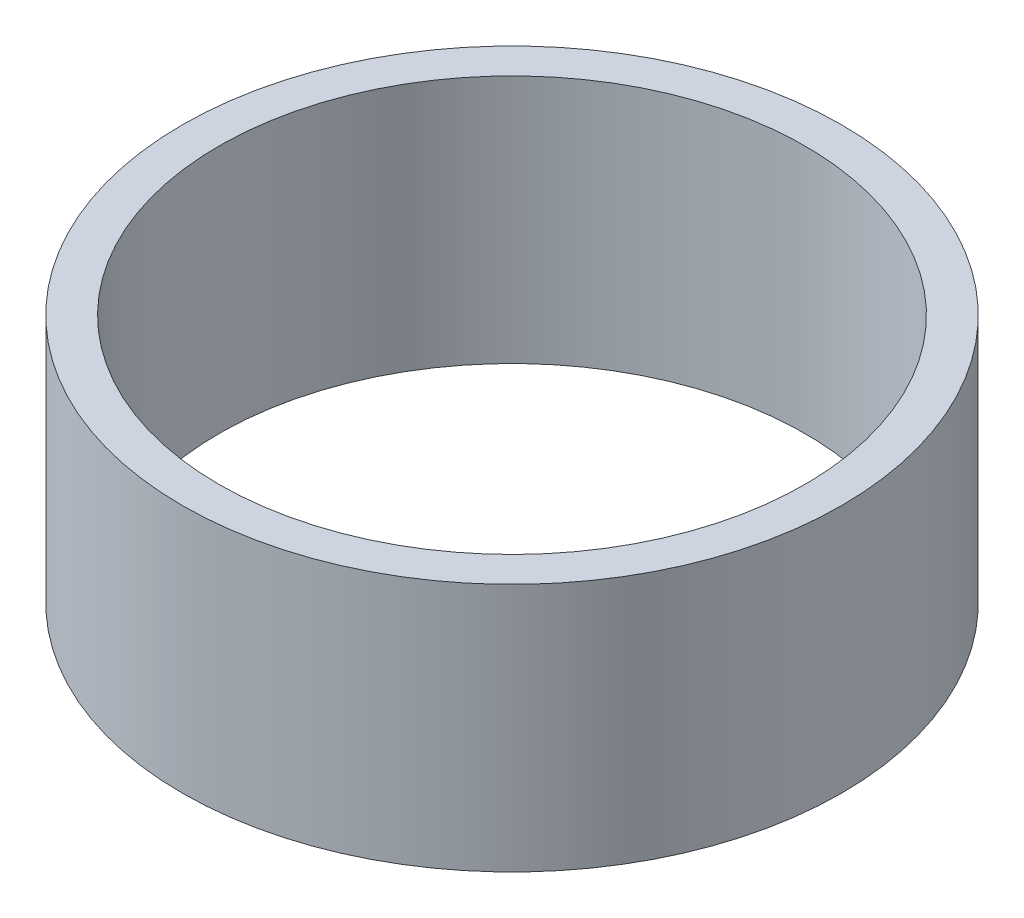
ISO-10303-21;
HEADER;
FILE_DESCRIPTION(('STEP AP214'),'2;1');
FILE_NAME('part.step','',(''),(''),'','','');
FILE_SCHEMA(('AUTOMOTIVE_DESIGN { 1 0 10303 214 1 1 1 1 }'));
ENDSEC;
DATA;
#1=APPLICATION_CONTEXT('core data for automotive mechanical design processes');
#2=APPLICATION_PROTOCOL_DEFINITION('international standard','automotive_design',2000,#1);
#3=PRODUCT_CONTEXT('',#1,'mechanical');
#4=PRODUCT('Part','Part','',(#3));
#5=PRODUCT_RELATED_PRODUCT_CATEGORY('part','',(#4));
#6=PRODUCT_DEFINITION_FORMATION('','',#4);
#7=PRODUCT_DEFINITION_CONTEXT('part definition',#1,'design');
#8=PRODUCT_DEFINITION('design','',#6,#7);
#9=PRODUCT_DEFINITION_SHAPE('','',#8);
#10=(LENGTH_UNIT() NAMED_UNIT(*) SI_UNIT(.MILLI.,.METRE.));
#11=(NAMED_UNIT(*) PLANE_ANGLE_UNIT() SI_UNIT($,.RADIAN.));
#12=(NAMED_UNIT(*) SI_UNIT($,.STERADIAN.) SOLID_ANGLE_UNIT());
#13=UNCERTAINTY_MEASURE_WITH_UNIT(LENGTH_MEASURE(1.E-05),#10,'distance_accuracy_value','');
#14=(GEOMETRIC_REPRESENTATION_CONTEXT(3) GLOBAL_UNCERTAINTY_ASSIGNED_CONTEXT((#13)) GLOBAL_UNIT_ASSIGNED_CONTEXT((#10,
#11,#12)) REPRESENTATION_CONTEXT('',''));
#15=CARTESIAN_POINT('',(0.,0.,0.));
#16=DIRECTION('',(0.,0.,1.));
#17=DIRECTION('',(1.,0.,0.));
#18=AXIS2_PLACEMENT_3D('',#15,#16,#17);
#19=CARTESIAN_POINT('',(0.,3.4,0.));
#20=DIRECTION('',(0.,1.,0.));
#21=DIRECTION('',(0.,0.,1.));
#22=AXIS2_PLACEMENT_3D('',#19,#20,#21);
#23=PLANE('',#22);
#24=CARTESIAN_POINT('',(0.,3.4,0.));
#25=DIRECTION('',(0.,1.,0.));
#26=DIRECTION('',(0.,0.,1.));
#27=AXIS2_PLACEMENT_3D('',#24,#25,#26);
#28=CIRCLE('',#27,4.5);
#29=CARTESIAN_POINT('',(0.,3.4,4.5));
#30=VERTEX_POINT('',#29);
#31=EDGE_CURVE('E10',#30,#30,#28,.T.);
#32=ORIENTED_EDGE('',*,*,#31,.T.);
#33=EDGE_LOOP('',(#32));
#34=FACE_BOUND('',#33,.T.);
#35=CARTESIAN_POINT('',(0.,3.4,0.));
#36=DIRECTION('',(0.,1.,0.));
#37=DIRECTION('',(0.,0.,1.));
#38=AXIS2_PLACEMENT_3D('',#35,#36,#37);
#39=CIRCLE('',#38,4.);
#40=CARTESIAN_POINT('',(0.,3.4,4.));
#41=VERTEX_POINT('',#40);
#42=EDGE_CURVE('E42',#41,#41,#39,.T.);
#43=ORIENTED_EDGE('',*,*,#42,.F.);
#44=EDGE_LOOP('',(#43));
#45=FACE_BOUND('',#44,.T.);
#46=ADVANCED_FACE('F31',(#34,#45),#23,.T.);
#47=CARTESIAN_POINT('',(0.,0.,0.));
#48=DIRECTION('',(0.,1.,0.));
#49=DIRECTION('',(0.,0.,1.));
#50=AXIS2_PLACEMENT_3D('',#47,#48,#49);
#51=PLANE('',#50);
#52=CARTESIAN_POINT('',(0.,0.,0.));
#53=DIRECTION('',(0.,1.,0.));
#54=DIRECTION('',(0.,0.,1.));
#55=AXIS2_PLACEMENT_3D('',#52,#53,#54);
#56=CIRCLE('',#55,4.5);
#57=CARTESIAN_POINT('',(0.,0.,4.5));
#58=VERTEX_POINT('',#57);
#59=EDGE_CURVE('E35',#58,#58,#56,.T.);
#60=ORIENTED_EDGE('',*,*,#59,.F.);
#61=EDGE_LOOP('',(#60));
#62=FACE_BOUND('',#61,.T.);
#63=CARTESIAN_POINT('',(0.,0.,0.));
#64=DIRECTION('',(0.,1.,0.));
#65=DIRECTION('',(0.,0.,1.));
#66=AXIS2_PLACEMENT_3D('',#63,#64,#65);
#67=CIRCLE('',#66,4.);
#68=CARTESIAN_POINT('',(0.,0.,4.));
#69=VERTEX_POINT('',#68);
#70=EDGE_CURVE('E44',#69,#69,#67,.T.);
#71=ORIENTED_EDGE('',*,*,#70,.T.);
#72=EDGE_LOOP('',(#71));
#73=FACE_BOUND('',#72,.T.);
#74=ADVANCED_FACE('F54',(#62,#73),#51,.F.);
#75=CARTESIAN_POINT('',(0.,3.4,0.));
#76=DIRECTION('',(0.,-1.,0.));
#77=DIRECTION('',(0.,0.,-1.));
#78=AXIS2_PLACEMENT_3D('',#75,#76,#77);
#79=CYLINDRICAL_SURFACE('',#78,4.5);
#80=ORIENTED_EDGE('',*,*,#31,.F.);
#81=EDGE_LOOP('',(#80));
#82=FACE_BOUND('',#81,.T.);
#83=ORIENTED_EDGE('',*,*,#59,.T.);
#84=EDGE_LOOP('',(#83));
#85=FACE_BOUND('',#84,.T.);
#86=ADVANCED_FACE('F33',(#82,#85),#79,.T.);
#87=CARTESIAN_POINT('',(0.,3.4,0.));
#88=DIRECTION('',(0.,-1.,0.));
#89=DIRECTION('',(0.,0.,-1.));
#90=AXIS2_PLACEMENT_3D('',#87,#88,#89);
#91=CYLINDRICAL_SURFACE('',#90,4.);
#92=ORIENTED_EDGE('',*,*,#42,.T.);
#93=EDGE_LOOP('',(#92));
#94=FACE_BOUND('',#93,.T.);
#95=ORIENTED_EDGE('',*,*,#70,.F.);
#96=EDGE_LOOP('',(#95));
#97=FACE_BOUND('',#96,.T.);
#98=ADVANCED_FACE('F50',(#94,#97),#91,.F.);
#99=CLOSED_SHELL('',(#46,#74,#86,#98));
#100=MANIFOLD_SOLID_BREP('B2',#99);
#101=ADVANCED_BREP_SHAPE_REPRESENTATION('',(#18,#100),#14);
#102=SHAPE_DEFINITION_REPRESENTATION(#9,#101);
ENDSEC;
END-ISO-10303-21;
